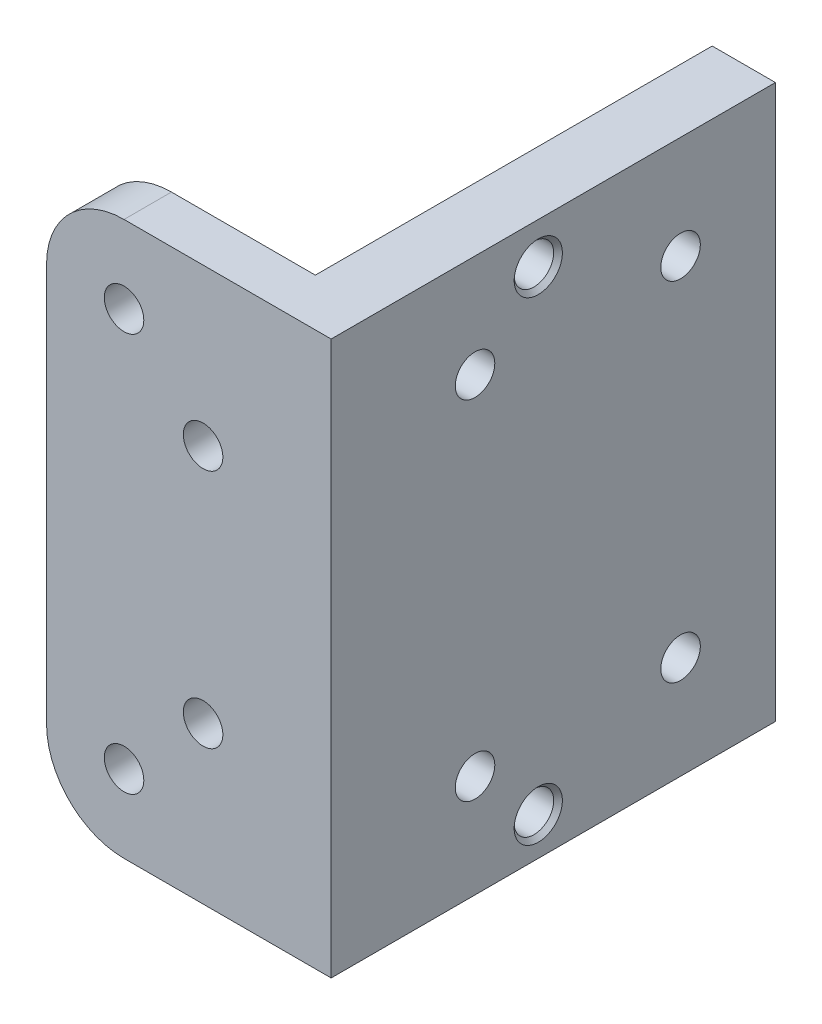
ISO-10303-21;
HEADER;
FILE_DESCRIPTION(('STEP AP214'),'2;1');
FILE_NAME('part.step','',(''),(''),'','','');
FILE_SCHEMA(('AUTOMOTIVE_DESIGN { 1 0 10303 214 1 1 1 1 }'));
ENDSEC;
DATA;
#1=APPLICATION_CONTEXT('core data for automotive mechanical design processes');
#2=APPLICATION_PROTOCOL_DEFINITION('international standard','automotive_design',2000,#1);
#3=PRODUCT_CONTEXT('',#1,'mechanical');
#4=PRODUCT('Part','Part','',(#3));
#5=PRODUCT_RELATED_PRODUCT_CATEGORY('part','',(#4));
#6=PRODUCT_DEFINITION_FORMATION('','',#4);
#7=PRODUCT_DEFINITION_CONTEXT('part definition',#1,'design');
#8=PRODUCT_DEFINITION('design','',#6,#7);
#9=PRODUCT_DEFINITION_SHAPE('','',#8);
#10=(LENGTH_UNIT() NAMED_UNIT(*) SI_UNIT(.MILLI.,.METRE.));
#11=(NAMED_UNIT(*) PLANE_ANGLE_UNIT() SI_UNIT($,.RADIAN.));
#12=(NAMED_UNIT(*) SI_UNIT($,.STERADIAN.) SOLID_ANGLE_UNIT());
#13=UNCERTAINTY_MEASURE_WITH_UNIT(LENGTH_MEASURE(1.E-05),#10,'distance_accuracy_value','');
#14=(GEOMETRIC_REPRESENTATION_CONTEXT(3) GLOBAL_UNCERTAINTY_ASSIGNED_CONTEXT((#13)) GLOBAL_UNIT_ASSIGNED_CONTEXT((#10,
#11,#12)) REPRESENTATION_CONTEXT('',''));
#15=CARTESIAN_POINT('',(0.,0.,0.));
#16=DIRECTION('',(0.,0.,1.));
#17=DIRECTION('',(1.,0.,0.));
#18=AXIS2_PLACEMENT_3D('',#15,#16,#17);
#19=CARTESIAN_POINT('',(36.4490157630866,-46.6386468268696,0.1));
#20=DIRECTION('',(0.,0.,1.));
#21=DIRECTION('',(1.,0.,0.));
#22=AXIS2_PLACEMENT_3D('',#19,#20,#21);
#23=PLANE('',#22);
#24=CARTESIAN_POINT('',(-4.1,-21.3115488460901,0.1));
#25=DIRECTION('',(0.,0.,-1.));
#26=DIRECTION('',(1.,0.,0.));
#27=AXIS2_PLACEMENT_3D('',#24,#25,#26);
#28=CIRCLE('',#27,1.25);
#29=CARTESIAN_POINT('',(-2.85,-21.3115488460901,0.1));
#30=VERTEX_POINT('',#29);
#31=EDGE_CURVE('E178',#30,#30,#28,.T.);
#32=ORIENTED_EDGE('',*,*,#31,.F.);
#33=EDGE_LOOP('',(#32));
#34=FACE_BOUND('',#33,.T.);
#35=CARTESIAN_POINT('',(-4.1,-36.5115488460901,0.1));
#36=DIRECTION('',(0.,0.,-1.));
#37=DIRECTION('',(1.,0.,0.));
#38=AXIS2_PLACEMENT_3D('',#35,#36,#37);
#39=CIRCLE('',#38,1.25);
#40=CARTESIAN_POINT('',(-2.85,-36.5115488460901,0.1));
#41=VERTEX_POINT('',#40);
#42=EDGE_CURVE('E239',#41,#41,#39,.T.);
#43=ORIENTED_EDGE('',*,*,#42,.F.);
#44=EDGE_LOOP('',(#43));
#45=FACE_BOUND('',#44,.T.);
#46=CARTESIAN_POINT('',(-9.1,-41.5115488460901,0.1));
#47=DIRECTION('',(0.,0.,-1.));
#48=DIRECTION('',(1.,0.,0.));
#49=AXIS2_PLACEMENT_3D('',#46,#47,#48);
#50=CIRCLE('',#49,1.25);
#51=CARTESIAN_POINT('',(-7.85,-41.5115488460901,0.1));
#52=VERTEX_POINT('',#51);
#53=EDGE_CURVE('E247',#52,#52,#50,.T.);
#54=ORIENTED_EDGE('',*,*,#53,.F.);
#55=EDGE_LOOP('',(#54));
#56=FACE_BOUND('',#55,.T.);
#57=CARTESIAN_POINT('',(-9.1,-16.3115488460901,0.1));
#58=DIRECTION('',(0.,0.,-1.));
#59=DIRECTION('',(1.,0.,0.));
#60=AXIS2_PLACEMENT_3D('',#57,#58,#59);
#61=CIRCLE('',#60,1.25);
#62=CARTESIAN_POINT('',(-7.85,-16.3115488460901,0.1));
#63=VERTEX_POINT('',#62);
#64=EDGE_CURVE('E231',#63,#63,#61,.T.);
#65=ORIENTED_EDGE('',*,*,#64,.F.);
#66=EDGE_LOOP('',(#65));
#67=FACE_BOUND('',#66,.T.);
#68=DIRECTION('',(0.,1.,0.));
#69=VECTOR('',#68,1.);
#70=CARTESIAN_POINT('',(0.,-46.6386468268696,0.1));
#71=LINE('',#70,#69);
#72=CARTESIAN_POINT('',(0.,-46.4115488460901,0.1));
#73=VERTEX_POINT('',#72);
#74=CARTESIAN_POINT('',(0.,-11.4115488460901,0.1));
#75=VERTEX_POINT('',#74);
#76=EDGE_CURVE('E10',#73,#75,#71,.T.);
#77=ORIENTED_EDGE('',*,*,#76,.F.);
#78=DIRECTION('',(1.,0.,0.));
#79=VECTOR('',#78,1.);
#80=CARTESIAN_POINT('',(0.,-46.4115488460901,0.1));
#81=LINE('',#80,#79);
#82=CARTESIAN_POINT('',(-9.1,-46.4115488460901,0.1));
#83=VERTEX_POINT('',#82);
#84=EDGE_CURVE('E181',#83,#73,#81,.T.);
#85=ORIENTED_EDGE('',*,*,#84,.F.);
#86=CARTESIAN_POINT('',(-9.1,-41.5115488460901,0.1));
#87=DIRECTION('',(0.,0.,-1.));
#88=DIRECTION('',(1.,0.,0.));
#89=AXIS2_PLACEMENT_3D('',#86,#87,#88);
#90=CIRCLE('',#89,4.9);
#91=CARTESIAN_POINT('',(-14.,-41.5115488460901,0.1));
#92=VERTEX_POINT('',#91);
#93=EDGE_CURVE('E48',#83,#92,#90,.T.);
#94=ORIENTED_EDGE('',*,*,#93,.T.);
#95=DIRECTION('',(0.,1.,0.));
#96=VECTOR('',#95,1.);
#97=CARTESIAN_POINT('',(-14.,-46.6386468268696,0.1));
#98=LINE('',#97,#96);
#99=CARTESIAN_POINT('',(-14.,-16.3115488460901,0.1));
#100=VERTEX_POINT('',#99);
#101=EDGE_CURVE('E211',#92,#100,#98,.T.);
#102=ORIENTED_EDGE('',*,*,#101,.T.);
#103=CARTESIAN_POINT('',(-9.1,-16.3115488460901,0.1));
#104=DIRECTION('',(0.,0.,-1.));
#105=DIRECTION('',(1.,0.,0.));
#106=AXIS2_PLACEMENT_3D('',#103,#104,#105);
#107=CIRCLE('',#106,4.9);
#108=CARTESIAN_POINT('',(-9.1,-11.4115488460901,0.1));
#109=VERTEX_POINT('',#108);
#110=EDGE_CURVE('E192',#100,#109,#107,.T.);
#111=ORIENTED_EDGE('',*,*,#110,.T.);
#112=DIRECTION('',(-1.,0.,0.));
#113=VECTOR('',#112,1.);
#114=CARTESIAN_POINT('',(4.,-11.4115488460901,0.1));
#115=LINE('',#114,#113);
#116=EDGE_CURVE('E160',#75,#109,#115,.T.);
#117=ORIENTED_EDGE('',*,*,#116,.F.);
#118=EDGE_LOOP('',(#77,#85,#94,#102,#111,#117));
#119=FACE_BOUND('',#118,.T.);
#120=ADVANCED_FACE('F16',(#34,#45,#56,#67,#119),#23,.F.);
#121=CARTESIAN_POINT('',(0.,0.,3.1));
#122=DIRECTION('',(0.,0.,1.));
#123=DIRECTION('',(1.,0.,0.));
#124=AXIS2_PLACEMENT_3D('',#121,#122,#123);
#125=PLANE('',#124);
#126=CARTESIAN_POINT('',(-4.1,-21.3115488460901,3.1));
#127=DIRECTION('',(0.,0.,-1.));
#128=DIRECTION('',(1.,0.,0.));
#129=AXIS2_PLACEMENT_3D('',#126,#127,#128);
#130=CIRCLE('',#129,1.25);
#131=CARTESIAN_POINT('',(-2.85,-21.3115488460901,3.1));
#132=VERTEX_POINT('',#131);
#133=EDGE_CURVE('E174',#132,#132,#130,.T.);
#134=ORIENTED_EDGE('',*,*,#133,.T.);
#135=EDGE_LOOP('',(#134));
#136=FACE_BOUND('',#135,.T.);
#137=CARTESIAN_POINT('',(-9.1,-16.3115488460901,3.1));
#138=DIRECTION('',(0.,0.,-1.));
#139=DIRECTION('',(1.,0.,0.));
#140=AXIS2_PLACEMENT_3D('',#137,#138,#139);
#141=CIRCLE('',#140,1.25);
#142=CARTESIAN_POINT('',(-7.85,-16.3115488460901,3.1));
#143=VERTEX_POINT('',#142);
#144=EDGE_CURVE('E227',#143,#143,#141,.T.);
#145=ORIENTED_EDGE('',*,*,#144,.T.);
#146=EDGE_LOOP('',(#145));
#147=FACE_BOUND('',#146,.T.);
#148=CARTESIAN_POINT('',(-4.1,-36.5115488460901,3.1));
#149=DIRECTION('',(0.,0.,-1.));
#150=DIRECTION('',(1.,0.,0.));
#151=AXIS2_PLACEMENT_3D('',#148,#149,#150);
#152=CIRCLE('',#151,1.25);
#153=CARTESIAN_POINT('',(-2.85,-36.5115488460901,3.1));
#154=VERTEX_POINT('',#153);
#155=EDGE_CURVE('E235',#154,#154,#152,.T.);
#156=ORIENTED_EDGE('',*,*,#155,.T.);
#157=EDGE_LOOP('',(#156));
#158=FACE_BOUND('',#157,.T.);
#159=CARTESIAN_POINT('',(-9.1,-41.5115488460901,3.1));
#160=DIRECTION('',(0.,0.,-1.));
#161=DIRECTION('',(1.,0.,0.));
#162=AXIS2_PLACEMENT_3D('',#159,#160,#161);
#163=CIRCLE('',#162,1.25);
#164=CARTESIAN_POINT('',(-7.85,-41.5115488460901,3.1));
#165=VERTEX_POINT('',#164);
#166=EDGE_CURVE('E243',#165,#165,#163,.T.);
#167=ORIENTED_EDGE('',*,*,#166,.T.);
#168=EDGE_LOOP('',(#167));
#169=FACE_BOUND('',#168,.T.);
#170=CARTESIAN_POINT('',(-9.1,-41.5115488460901,3.1));
#171=DIRECTION('',(0.,0.,-1.));
#172=DIRECTION('',(1.,0.,0.));
#173=AXIS2_PLACEMENT_3D('',#170,#171,#172);
#174=CIRCLE('',#173,4.9);
#175=CARTESIAN_POINT('',(-9.1,-46.4115488460901,3.1));
#176=VERTEX_POINT('',#175);
#177=CARTESIAN_POINT('',(-14.,-41.5115488460901,3.1));
#178=VERTEX_POINT('',#177);
#179=EDGE_CURVE('E37',#176,#178,#174,.T.);
#180=ORIENTED_EDGE('',*,*,#179,.F.);
#181=DIRECTION('',(-1.,0.,0.));
#182=VECTOR('',#181,1.);
#183=CARTESIAN_POINT('',(-9.1,-46.4115488460901,3.1));
#184=LINE('',#183,#182);
#185=CARTESIAN_POINT('',(4.,-46.4115488460901,3.1));
#186=VERTEX_POINT('',#185);
#187=EDGE_CURVE('E134',#186,#176,#184,.T.);
#188=ORIENTED_EDGE('',*,*,#187,.F.);
#189=DIRECTION('',(0.,-1.,0.));
#190=VECTOR('',#189,1.);
#191=CARTESIAN_POINT('',(4.,-46.4115488460901,3.1));
#192=LINE('',#191,#190);
#193=CARTESIAN_POINT('',(4.,-11.4115488460901,3.1));
#194=VERTEX_POINT('',#193);
#195=EDGE_CURVE('E126',#194,#186,#192,.T.);
#196=ORIENTED_EDGE('',*,*,#195,.F.);
#197=DIRECTION('',(1.,0.,0.));
#198=VECTOR('',#197,1.);
#199=CARTESIAN_POINT('',(4.,-11.4115488460901,3.1));
#200=LINE('',#199,#198);
#201=CARTESIAN_POINT('',(-9.1,-11.4115488460901,3.1));
#202=VERTEX_POINT('',#201);
#203=EDGE_CURVE('E106',#202,#194,#200,.T.);
#204=ORIENTED_EDGE('',*,*,#203,.F.);
#205=CARTESIAN_POINT('',(-9.1,-16.3115488460901,3.1));
#206=DIRECTION('',(0.,0.,-1.));
#207=DIRECTION('',(1.,0.,0.));
#208=AXIS2_PLACEMENT_3D('',#205,#206,#207);
#209=CIRCLE('',#208,4.9);
#210=CARTESIAN_POINT('',(-14.,-16.3115488460901,3.1));
#211=VERTEX_POINT('',#210);
#212=EDGE_CURVE('E208',#211,#202,#209,.T.);
#213=ORIENTED_EDGE('',*,*,#212,.F.);
#214=DIRECTION('',(0.,1.,0.));
#215=VECTOR('',#214,1.);
#216=CARTESIAN_POINT('',(-14.,-16.3115488460901,3.1));
#217=LINE('',#216,#215);
#218=EDGE_CURVE('E217',#178,#211,#217,.T.);
#219=ORIENTED_EDGE('',*,*,#218,.F.);
#220=EDGE_LOOP('',(#180,#188,#196,#204,#213,#219));
#221=FACE_BOUND('',#220,.T.);
#222=ADVANCED_FACE('F132',(#136,#147,#158,#169,#221),#125,.T.);
#223=CARTESIAN_POINT('',(0.,-11.4115488460901,-25.));
#224=DIRECTION('',(1.,0.,0.));
#225=DIRECTION('',(0.,-1.,0.));
#226=AXIS2_PLACEMENT_3D('',#223,#224,#225);
#227=PLANE('',#226);
#228=CARTESIAN_POINT('',(0.,-44.,-10.));
#229=DIRECTION('',(1.,0.,0.));
#230=DIRECTION('',(0.,1.,0.));
#231=AXIS2_PLACEMENT_3D('',#228,#229,#230);
#232=CIRCLE('',#231,1.25);
#233=CARTESIAN_POINT('',(0.,-42.75,-10.));
#234=VERTEX_POINT('',#233);
#235=EDGE_CURVE('E255',#234,#234,#232,.T.);
#236=ORIENTED_EDGE('',*,*,#235,.T.);
#237=EDGE_LOOP('',(#236));
#238=FACE_BOUND('',#237,.T.);
#239=CARTESIAN_POINT('',(0.,-14.,-10.));
#240=DIRECTION('',(1.,0.,0.));
#241=DIRECTION('',(0.,1.,0.));
#242=AXIS2_PLACEMENT_3D('',#239,#240,#241);
#243=CIRCLE('',#242,1.25);
#244=CARTESIAN_POINT('',(0.,-12.75,-10.));
#245=VERTEX_POINT('',#244);
#246=EDGE_CURVE('E269',#245,#245,#243,.T.);
#247=ORIENTED_EDGE('',*,*,#246,.T.);
#248=EDGE_LOOP('',(#247));
#249=FACE_BOUND('',#248,.T.);
#250=CARTESIAN_POINT('',(0.,-39.9115488460901,-6.));
#251=DIRECTION('',(1.,0.,0.));
#252=DIRECTION('',(0.,1.,0.));
#253=AXIS2_PLACEMENT_3D('',#250,#251,#252);
#254=CIRCLE('',#253,1.25);
#255=CARTESIAN_POINT('',(0.,-38.6615488460901,-6.));
#256=VERTEX_POINT('',#255);
#257=EDGE_CURVE('E265',#256,#256,#254,.T.);
#258=ORIENTED_EDGE('',*,*,#257,.T.);
#259=EDGE_LOOP('',(#258));
#260=FACE_BOUND('',#259,.T.);
#261=CARTESIAN_POINT('',(0.,-39.9115488460901,-19.));
#262=DIRECTION('',(1.,0.,0.));
#263=DIRECTION('',(0.,1.,0.));
#264=AXIS2_PLACEMENT_3D('',#261,#262,#263);
#265=CIRCLE('',#264,1.25);
#266=CARTESIAN_POINT('',(0.,-38.6615488460901,-19.));
#267=VERTEX_POINT('',#266);
#268=EDGE_CURVE('E260',#267,#267,#265,.T.);
#269=ORIENTED_EDGE('',*,*,#268,.T.);
#270=EDGE_LOOP('',(#269));
#271=FACE_BOUND('',#270,.T.);
#272=CARTESIAN_POINT('',(0.,-17.9115488460901,-19.));
#273=DIRECTION('',(1.,0.,0.));
#274=DIRECTION('',(0.,1.,0.));
#275=AXIS2_PLACEMENT_3D('',#272,#273,#274);
#276=CIRCLE('',#275,1.25);
#277=CARTESIAN_POINT('',(0.,-16.6615488460901,-19.));
#278=VERTEX_POINT('',#277);
#279=EDGE_CURVE('E264',#278,#278,#276,.T.);
#280=ORIENTED_EDGE('',*,*,#279,.T.);
#281=EDGE_LOOP('',(#280));
#282=FACE_BOUND('',#281,.T.);
#283=CARTESIAN_POINT('',(0.,-17.9115488460901,-6.));
#284=DIRECTION('',(1.,0.,0.));
#285=DIRECTION('',(0.,1.,0.));
#286=AXIS2_PLACEMENT_3D('',#283,#284,#285);
#287=CIRCLE('',#286,1.25);
#288=CARTESIAN_POINT('',(0.,-16.6615488460901,-6.));
#289=VERTEX_POINT('',#288);
#290=EDGE_CURVE('E279',#289,#289,#287,.T.);
#291=ORIENTED_EDGE('',*,*,#290,.T.);
#292=EDGE_LOOP('',(#291));
#293=FACE_BOUND('',#292,.T.);
#294=DIRECTION('',(0.,0.,1.));
#295=VECTOR('',#294,1.);
#296=CARTESIAN_POINT('',(0.,-46.4115488460901,-25.));
#297=LINE('',#296,#295);
#298=CARTESIAN_POINT('',(0.,-46.4115488460901,-25.));
#299=VERTEX_POINT('',#298);
#300=EDGE_CURVE('E184',#299,#73,#297,.T.);
#301=ORIENTED_EDGE('',*,*,#300,.T.);
#302=ORIENTED_EDGE('',*,*,#76,.T.);
#303=DIRECTION('',(0.,0.,1.));
#304=VECTOR('',#303,1.);
#305=CARTESIAN_POINT('',(0.,-11.4115488460901,-25.));
#306=LINE('',#305,#304);
#307=CARTESIAN_POINT('',(0.,-11.4115488460901,-25.));
#308=VERTEX_POINT('',#307);
#309=EDGE_CURVE('E163',#308,#75,#306,.T.);
#310=ORIENTED_EDGE('',*,*,#309,.F.);
#311=DIRECTION('',(0.,1.,0.));
#312=VECTOR('',#311,1.);
#313=CARTESIAN_POINT('',(0.,-11.4115488460901,-25.));
#314=LINE('',#313,#312);
#315=EDGE_CURVE('E24',#299,#308,#314,.T.);
#316=ORIENTED_EDGE('',*,*,#315,.F.);
#317=EDGE_LOOP('',(#301,#302,#310,#316));
#318=FACE_BOUND('',#317,.T.);
#319=ADVANCED_FACE('F290',(#238,#249,#260,#271,#282,#293,#318),#227,.F.);
#320=CARTESIAN_POINT('',(0.,0.,-25.));
#321=DIRECTION('',(0.,0.,1.));
#322=DIRECTION('',(1.,0.,0.));
#323=AXIS2_PLACEMENT_3D('',#320,#321,#322);
#324=PLANE('',#323);
#325=DIRECTION('',(-1.,0.,0.));
#326=VECTOR('',#325,1.);
#327=CARTESIAN_POINT('',(0.,-46.4115488460901,-25.));
#328=LINE('',#327,#326);
#329=CARTESIAN_POINT('',(4.,-46.4115488460901,-25.));
#330=VERTEX_POINT('',#329);
#331=EDGE_CURVE('E191',#330,#299,#328,.T.);
#332=ORIENTED_EDGE('',*,*,#331,.T.);
#333=ORIENTED_EDGE('',*,*,#315,.T.);
#334=DIRECTION('',(1.,0.,0.));
#335=VECTOR('',#334,1.);
#336=CARTESIAN_POINT('',(4.,-11.4115488460901,-25.));
#337=LINE('',#336,#335);
#338=CARTESIAN_POINT('',(4.,-11.4115488460901,-25.));
#339=VERTEX_POINT('',#338);
#340=EDGE_CURVE('E120',#308,#339,#337,.T.);
#341=ORIENTED_EDGE('',*,*,#340,.T.);
#342=DIRECTION('',(0.,-1.,0.));
#343=VECTOR('',#342,1.);
#344=CARTESIAN_POINT('',(4.,-46.4115488460901,-25.));
#345=LINE('',#344,#343);
#346=EDGE_CURVE('E128',#339,#330,#345,.T.);
#347=ORIENTED_EDGE('',*,*,#346,.T.);
#348=EDGE_LOOP('',(#332,#333,#341,#347));
#349=FACE_BOUND('',#348,.T.);
#350=ADVANCED_FACE('F286',(#349),#324,.F.);
#351=CARTESIAN_POINT('',(-21.,-17.9115488460901,-6.));
#352=DIRECTION('',(1.,0.,0.));
#353=DIRECTION('',(0.,0.,-1.));
#354=AXIS2_PLACEMENT_3D('',#351,#352,#353);
#355=CYLINDRICAL_SURFACE('',#354,1.25);
#356=CARTESIAN_POINT('',(4.,-17.9115488460901,-6.));
#357=DIRECTION('',(1.,0.,0.));
#358=DIRECTION('',(0.,0.,-1.));
#359=AXIS2_PLACEMENT_3D('',#356,#357,#358);
#360=CIRCLE('',#359,1.25);
#361=CARTESIAN_POINT('',(4.,-17.9115488460901,-7.25));
#362=VERTEX_POINT('',#361);
#363=EDGE_CURVE('E168',#362,#362,#360,.T.);
#364=ORIENTED_EDGE('',*,*,#363,.T.);
#365=EDGE_LOOP('',(#364));
#366=FACE_BOUND('',#365,.T.);
#367=ORIENTED_EDGE('',*,*,#290,.F.);
#368=EDGE_LOOP('',(#367));
#369=FACE_BOUND('',#368,.T.);
#370=ADVANCED_FACE('F371',(#366,#369),#355,.F.);
#371=CARTESIAN_POINT('',(-21.,-17.9115488460901,-19.));
#372=DIRECTION('',(1.,0.,0.));
#373=DIRECTION('',(0.,0.,-1.));
#374=AXIS2_PLACEMENT_3D('',#371,#372,#373);
#375=CYLINDRICAL_SURFACE('',#374,1.25);
#376=CARTESIAN_POINT('',(4.,-17.9115488460901,-19.));
#377=DIRECTION('',(1.,0.,0.));
#378=DIRECTION('',(0.,0.,-1.));
#379=AXIS2_PLACEMENT_3D('',#376,#377,#378);
#380=CIRCLE('',#379,1.25);
#381=CARTESIAN_POINT('',(4.,-17.9115488460901,-20.25));
#382=VERTEX_POINT('',#381);
#383=EDGE_CURVE('E164',#382,#382,#380,.T.);
#384=ORIENTED_EDGE('',*,*,#383,.T.);
#385=EDGE_LOOP('',(#384));
#386=FACE_BOUND('',#385,.T.);
#387=ORIENTED_EDGE('',*,*,#279,.F.);
#388=EDGE_LOOP('',(#387));
#389=FACE_BOUND('',#388,.T.);
#390=ADVANCED_FACE('F368',(#386,#389),#375,.F.);
#391=CARTESIAN_POINT('',(-21.,-39.9115488460901,-19.));
#392=DIRECTION('',(1.,0.,0.));
#393=DIRECTION('',(0.,0.,-1.));
#394=AXIS2_PLACEMENT_3D('',#391,#392,#393);
#395=CYLINDRICAL_SURFACE('',#394,1.25);
#396=CARTESIAN_POINT('',(4.,-39.9115488460901,-19.));
#397=DIRECTION('',(1.,0.,0.));
#398=DIRECTION('',(0.,0.,-1.));
#399=AXIS2_PLACEMENT_3D('',#396,#397,#398);
#400=CIRCLE('',#399,1.25);
#401=CARTESIAN_POINT('',(4.,-39.9115488460901,-20.25));
#402=VERTEX_POINT('',#401);
#403=EDGE_CURVE('E145',#402,#402,#400,.T.);
#404=ORIENTED_EDGE('',*,*,#403,.T.);
#405=EDGE_LOOP('',(#404));
#406=FACE_BOUND('',#405,.T.);
#407=ORIENTED_EDGE('',*,*,#268,.F.);
#408=EDGE_LOOP('',(#407));
#409=FACE_BOUND('',#408,.T.);
#410=ADVANCED_FACE('F364',(#406,#409),#395,.F.);
#411=CARTESIAN_POINT('',(-21.,-39.9115488460901,-6.));
#412=DIRECTION('',(1.,0.,0.));
#413=DIRECTION('',(0.,0.,-1.));
#414=AXIS2_PLACEMENT_3D('',#411,#412,#413);
#415=CYLINDRICAL_SURFACE('',#414,1.25);
#416=CARTESIAN_POINT('',(4.,-39.9115488460901,-6.));
#417=DIRECTION('',(1.,0.,0.));
#418=DIRECTION('',(0.,0.,-1.));
#419=AXIS2_PLACEMENT_3D('',#416,#417,#418);
#420=CIRCLE('',#419,1.25);
#421=CARTESIAN_POINT('',(4.,-39.9115488460901,-7.25));
#422=VERTEX_POINT('',#421);
#423=EDGE_CURVE('E156',#422,#422,#420,.T.);
#424=ORIENTED_EDGE('',*,*,#423,.T.);
#425=EDGE_LOOP('',(#424));
#426=FACE_BOUND('',#425,.T.);
#427=ORIENTED_EDGE('',*,*,#257,.F.);
#428=EDGE_LOOP('',(#427));
#429=FACE_BOUND('',#428,.T.);
#430=ADVANCED_FACE('F361',(#426,#429),#415,.F.);
#431=CARTESIAN_POINT('',(4.,-14.,-10.));
#432=DIRECTION('',(1.,0.,0.));
#433=DIRECTION('',(0.,0.,-1.));
#434=AXIS2_PLACEMENT_3D('',#431,#432,#433);
#435=CYLINDRICAL_SURFACE('',#434,1.25);
#436=CARTESIAN_POINT('',(3.725,-14.,-10.));
#437=DIRECTION('',(1.,0.,0.));
#438=DIRECTION('',(0.,0.,-1.));
#439=AXIS2_PLACEMENT_3D('',#436,#437,#438);
#440=CIRCLE('',#439,1.24999999999999);
#441=CARTESIAN_POINT('',(3.725,-14.,-11.25));
#442=VERTEX_POINT('',#441);
#443=EDGE_CURVE('E259',#442,#442,#440,.T.);
#444=ORIENTED_EDGE('',*,*,#443,.T.);
#445=EDGE_LOOP('',(#444));
#446=FACE_BOUND('',#445,.T.);
#447=ORIENTED_EDGE('',*,*,#246,.F.);
#448=EDGE_LOOP('',(#447));
#449=FACE_BOUND('',#448,.T.);
#450=ADVANCED_FACE('F359',(#446,#449),#435,.F.);
#451=CARTESIAN_POINT('',(4.,-14.,-10.));
#452=DIRECTION('',(1.,0.,0.));
#453=DIRECTION('',(0.,0.,-1.));
#454=AXIS2_PLACEMENT_3D('',#451,#452,#453);
#455=CONICAL_SURFACE('',#454,1.525,0.785398163397448);
#456=ORIENTED_EDGE('',*,*,#443,.F.);
#457=EDGE_LOOP('',(#456));
#458=FACE_BOUND('',#457,.T.);
#459=CARTESIAN_POINT('',(4.,-14.,-10.));
#460=DIRECTION('',(1.,0.,0.));
#461=DIRECTION('',(0.,0.,-1.));
#462=AXIS2_PLACEMENT_3D('',#459,#460,#461);
#463=CIRCLE('',#462,1.525);
#464=CARTESIAN_POINT('',(4.,-14.,-11.525));
#465=VERTEX_POINT('',#464);
#466=EDGE_CURVE('E151',#465,#465,#463,.T.);
#467=ORIENTED_EDGE('',*,*,#466,.T.);
#468=EDGE_LOOP('',(#467));
#469=FACE_BOUND('',#468,.T.);
#470=ADVANCED_FACE('F356',(#458,#469),#455,.F.);
#471=CARTESIAN_POINT('',(4.,-44.,-10.));
#472=DIRECTION('',(1.,0.,0.));
#473=DIRECTION('',(0.,0.,-1.));
#474=AXIS2_PLACEMENT_3D('',#471,#472,#473);
#475=CYLINDRICAL_SURFACE('',#474,1.25);
#476=CARTESIAN_POINT('',(3.725,-44.,-10.));
#477=DIRECTION('',(1.,0.,0.));
#478=DIRECTION('',(0.,0.,-1.));
#479=AXIS2_PLACEMENT_3D('',#476,#477,#478);
#480=CIRCLE('',#479,1.24999999999999);
#481=CARTESIAN_POINT('',(3.725,-44.,-11.25));
#482=VERTEX_POINT('',#481);
#483=EDGE_CURVE('E251',#482,#482,#480,.T.);
#484=ORIENTED_EDGE('',*,*,#483,.T.);
#485=EDGE_LOOP('',(#484));
#486=FACE_BOUND('',#485,.T.);
#487=ORIENTED_EDGE('',*,*,#235,.F.);
#488=EDGE_LOOP('',(#487));
#489=FACE_BOUND('',#488,.T.);
#490=ADVANCED_FACE('F351',(#486,#489),#475,.F.);
#491=CARTESIAN_POINT('',(4.,-44.,-10.));
#492=DIRECTION('',(1.,0.,0.));
#493=DIRECTION('',(0.,0.,-1.));
#494=AXIS2_PLACEMENT_3D('',#491,#492,#493);
#495=CONICAL_SURFACE('',#494,1.525,0.785398163397445);
#496=ORIENTED_EDGE('',*,*,#483,.F.);
#497=EDGE_LOOP('',(#496));
#498=FACE_BOUND('',#497,.T.);
#499=CARTESIAN_POINT('',(4.,-44.,-10.));
#500=DIRECTION('',(1.,0.,0.));
#501=DIRECTION('',(0.,0.,-1.));
#502=AXIS2_PLACEMENT_3D('',#499,#500,#501);
#503=CIRCLE('',#502,1.525);
#504=CARTESIAN_POINT('',(4.,-44.,-11.525));
#505=VERTEX_POINT('',#504);
#506=EDGE_CURVE('E130',#505,#505,#503,.T.);
#507=ORIENTED_EDGE('',*,*,#506,.T.);
#508=EDGE_LOOP('',(#507));
#509=FACE_BOUND('',#508,.T.);
#510=ADVANCED_FACE('F342',(#498,#509),#495,.F.);
#511=CARTESIAN_POINT('',(-9.1,-41.5115488460901,10.));
#512=DIRECTION('',(0.,0.,-1.));
#513=DIRECTION('',(-1.,0.,0.));
#514=AXIS2_PLACEMENT_3D('',#511,#512,#513);
#515=CYLINDRICAL_SURFACE('',#514,1.25);
#516=ORIENTED_EDGE('',*,*,#53,.T.);
#517=EDGE_LOOP('',(#516));
#518=FACE_BOUND('',#517,.T.);
#519=ORIENTED_EDGE('',*,*,#166,.F.);
#520=EDGE_LOOP('',(#519));
#521=FACE_BOUND('',#520,.T.);
#522=ADVANCED_FACE('F340',(#518,#521),#515,.F.);
#523=CARTESIAN_POINT('',(-4.1,-36.5115488460901,10.));
#524=DIRECTION('',(0.,0.,-1.));
#525=DIRECTION('',(-1.,0.,0.));
#526=AXIS2_PLACEMENT_3D('',#523,#524,#525);
#527=CYLINDRICAL_SURFACE('',#526,1.25);
#528=ORIENTED_EDGE('',*,*,#42,.T.);
#529=EDGE_LOOP('',(#528));
#530=FACE_BOUND('',#529,.T.);
#531=ORIENTED_EDGE('',*,*,#155,.F.);
#532=EDGE_LOOP('',(#531));
#533=FACE_BOUND('',#532,.T.);
#534=ADVANCED_FACE('F331',(#530,#533),#527,.F.);
#535=CARTESIAN_POINT('',(-9.1,-16.3115488460901,10.));
#536=DIRECTION('',(0.,0.,-1.));
#537=DIRECTION('',(-1.,0.,0.));
#538=AXIS2_PLACEMENT_3D('',#535,#536,#537);
#539=CYLINDRICAL_SURFACE('',#538,1.25);
#540=ORIENTED_EDGE('',*,*,#64,.T.);
#541=EDGE_LOOP('',(#540));
#542=FACE_BOUND('',#541,.T.);
#543=ORIENTED_EDGE('',*,*,#144,.F.);
#544=EDGE_LOOP('',(#543));
#545=FACE_BOUND('',#544,.T.);
#546=ADVANCED_FACE('F327',(#542,#545),#539,.F.);
#547=CARTESIAN_POINT('',(-4.1,-21.3115488460901,10.));
#548=DIRECTION('',(0.,0.,-1.));
#549=DIRECTION('',(-1.,0.,0.));
#550=AXIS2_PLACEMENT_3D('',#547,#548,#549);
#551=CYLINDRICAL_SURFACE('',#550,1.25);
#552=ORIENTED_EDGE('',*,*,#31,.T.);
#553=EDGE_LOOP('',(#552));
#554=FACE_BOUND('',#553,.T.);
#555=ORIENTED_EDGE('',*,*,#133,.F.);
#556=EDGE_LOOP('',(#555));
#557=FACE_BOUND('',#556,.T.);
#558=ADVANCED_FACE('F330',(#554,#557),#551,.F.);
#559=CARTESIAN_POINT('',(-9.1,-41.5115488460901,10.));
#560=DIRECTION('',(0.,0.,-1.));
#561=DIRECTION('',(-1.,0.,0.));
#562=AXIS2_PLACEMENT_3D('',#559,#560,#561);
#563=CYLINDRICAL_SURFACE('',#562,4.9);
#564=ORIENTED_EDGE('',*,*,#93,.F.);
#565=DIRECTION('',(0.,0.,-1.));
#566=VECTOR('',#565,1.);
#567=CARTESIAN_POINT('',(-9.1,-46.4115488460901,10.));
#568=LINE('',#567,#566);
#569=EDGE_CURVE('E196',#176,#83,#568,.T.);
#570=ORIENTED_EDGE('',*,*,#569,.F.);
#571=ORIENTED_EDGE('',*,*,#179,.T.);
#572=DIRECTION('',(0.,0.,-1.));
#573=VECTOR('',#572,1.);
#574=CARTESIAN_POINT('',(-14.,-41.5115488460901,10.));
#575=LINE('',#574,#573);
#576=EDGE_CURVE('E214',#178,#92,#575,.T.);
#577=ORIENTED_EDGE('',*,*,#576,.T.);
#578=EDGE_LOOP('',(#564,#570,#571,#577));
#579=FACE_BOUND('',#578,.T.);
#580=ADVANCED_FACE('F300',(#579),#563,.T.);
#581=CARTESIAN_POINT('',(-14.,-41.5115488460901,10.));
#582=DIRECTION('',(-1.,0.,0.));
#583=DIRECTION('',(0.,1.,0.));
#584=AXIS2_PLACEMENT_3D('',#581,#582,#583);
#585=PLANE('',#584);
#586=ORIENTED_EDGE('',*,*,#101,.F.);
#587=ORIENTED_EDGE('',*,*,#576,.F.);
#588=ORIENTED_EDGE('',*,*,#218,.T.);
#589=DIRECTION('',(0.,0.,-1.));
#590=VECTOR('',#589,1.);
#591=CARTESIAN_POINT('',(-14.,-16.3115488460901,10.));
#592=LINE('',#591,#590);
#593=EDGE_CURVE('E195',#211,#100,#592,.T.);
#594=ORIENTED_EDGE('',*,*,#593,.T.);
#595=EDGE_LOOP('',(#586,#587,#588,#594));
#596=FACE_BOUND('',#595,.T.);
#597=ADVANCED_FACE('F299',(#596),#585,.T.);
#598=CARTESIAN_POINT('',(-9.1,-16.3115488460901,10.));
#599=DIRECTION('',(0.,0.,-1.));
#600=DIRECTION('',(-1.,0.,0.));
#601=AXIS2_PLACEMENT_3D('',#598,#599,#600);
#602=CYLINDRICAL_SURFACE('',#601,4.9);
#603=ORIENTED_EDGE('',*,*,#110,.F.);
#604=ORIENTED_EDGE('',*,*,#593,.F.);
#605=ORIENTED_EDGE('',*,*,#212,.T.);
#606=DIRECTION('',(0.,0.,-1.));
#607=VECTOR('',#606,1.);
#608=CARTESIAN_POINT('',(-9.1,-11.4115488460901,10.));
#609=LINE('',#608,#607);
#610=EDGE_CURVE('E115',#202,#109,#609,.T.);
#611=ORIENTED_EDGE('',*,*,#610,.T.);
#612=EDGE_LOOP('',(#603,#604,#605,#611));
#613=FACE_BOUND('',#612,.T.);
#614=ADVANCED_FACE('F296',(#613),#602,.T.);
#615=CARTESIAN_POINT('',(0.,-46.4115488460901,-25.));
#616=DIRECTION('',(0.,1.,0.));
#617=DIRECTION('',(1.,0.,0.));
#618=AXIS2_PLACEMENT_3D('',#615,#616,#617);
#619=PLANE('',#618);
#620=ORIENTED_EDGE('',*,*,#84,.T.);
#621=ORIENTED_EDGE('',*,*,#300,.F.);
#622=ORIENTED_EDGE('',*,*,#331,.F.);
#623=DIRECTION('',(0.,0.,1.));
#624=VECTOR('',#623,1.);
#625=CARTESIAN_POINT('',(4.,-46.4115488460901,-25.));
#626=LINE('',#625,#624);
#627=EDGE_CURVE('E137',#330,#186,#626,.T.);
#628=ORIENTED_EDGE('',*,*,#627,.T.);
#629=ORIENTED_EDGE('',*,*,#187,.T.);
#630=ORIENTED_EDGE('',*,*,#569,.T.);
#631=EDGE_LOOP('',(#620,#621,#622,#628,#629,#630));
#632=FACE_BOUND('',#631,.T.);
#633=ADVANCED_FACE('F302',(#632),#619,.F.);
#634=CARTESIAN_POINT('',(4.,-11.4115488460901,-25.));
#635=DIRECTION('',(0.,-1.,0.));
#636=DIRECTION('',(0.,0.,-1.));
#637=AXIS2_PLACEMENT_3D('',#634,#635,#636);
#638=PLANE('',#637);
#639=ORIENTED_EDGE('',*,*,#309,.T.);
#640=ORIENTED_EDGE('',*,*,#116,.T.);
#641=ORIENTED_EDGE('',*,*,#610,.F.);
#642=ORIENTED_EDGE('',*,*,#203,.T.);
#643=DIRECTION('',(0.,0.,1.));
#644=VECTOR('',#643,1.);
#645=CARTESIAN_POINT('',(4.,-11.4115488460901,-25.));
#646=LINE('',#645,#644);
#647=EDGE_CURVE('E111',#339,#194,#646,.T.);
#648=ORIENTED_EDGE('',*,*,#647,.F.);
#649=ORIENTED_EDGE('',*,*,#340,.F.);
#650=EDGE_LOOP('',(#639,#640,#641,#642,#648,#649));
#651=FACE_BOUND('',#650,.T.);
#652=ADVANCED_FACE('F109',(#651),#638,.F.);
#653=CARTESIAN_POINT('',(4.,-46.4115488460901,-25.));
#654=DIRECTION('',(-1.,0.,0.));
#655=DIRECTION('',(0.,0.,1.));
#656=AXIS2_PLACEMENT_3D('',#653,#654,#655);
#657=PLANE('',#656);
#658=ORIENTED_EDGE('',*,*,#363,.F.);
#659=EDGE_LOOP('',(#658));
#660=FACE_BOUND('',#659,.T.);
#661=ORIENTED_EDGE('',*,*,#383,.F.);
#662=EDGE_LOOP('',(#661));
#663=FACE_BOUND('',#662,.T.);
#664=ORIENTED_EDGE('',*,*,#403,.F.);
#665=EDGE_LOOP('',(#664));
#666=FACE_BOUND('',#665,.T.);
#667=ORIENTED_EDGE('',*,*,#423,.F.);
#668=EDGE_LOOP('',(#667));
#669=FACE_BOUND('',#668,.T.);
#670=ORIENTED_EDGE('',*,*,#466,.F.);
#671=EDGE_LOOP('',(#670));
#672=FACE_BOUND('',#671,.T.);
#673=ORIENTED_EDGE('',*,*,#506,.F.);
#674=EDGE_LOOP('',(#673));
#675=FACE_BOUND('',#674,.T.);
#676=ORIENTED_EDGE('',*,*,#195,.T.);
#677=ORIENTED_EDGE('',*,*,#627,.F.);
#678=ORIENTED_EDGE('',*,*,#346,.F.);
#679=ORIENTED_EDGE('',*,*,#647,.T.);
#680=EDGE_LOOP('',(#676,#677,#678,#679));
#681=FACE_BOUND('',#680,.T.);
#682=ADVANCED_FACE('F124',(#660,#663,#666,#669,#672,#675,#681),#657,.F.);
#683=CLOSED_SHELL('',(#120,#222,#319,#350,#370,#390,#410,#430,#450,#470,#490,#510,#522,#534,
#546,#558,#580,#597,#614,#633,#652,#682));
#684=MANIFOLD_SOLID_BREP('B1',#683);
#685=ADVANCED_BREP_SHAPE_REPRESENTATION('',(#18,#684),#14);
#686=SHAPE_DEFINITION_REPRESENTATION(#9,#685);
ENDSEC;
END-ISO-10303-21;
